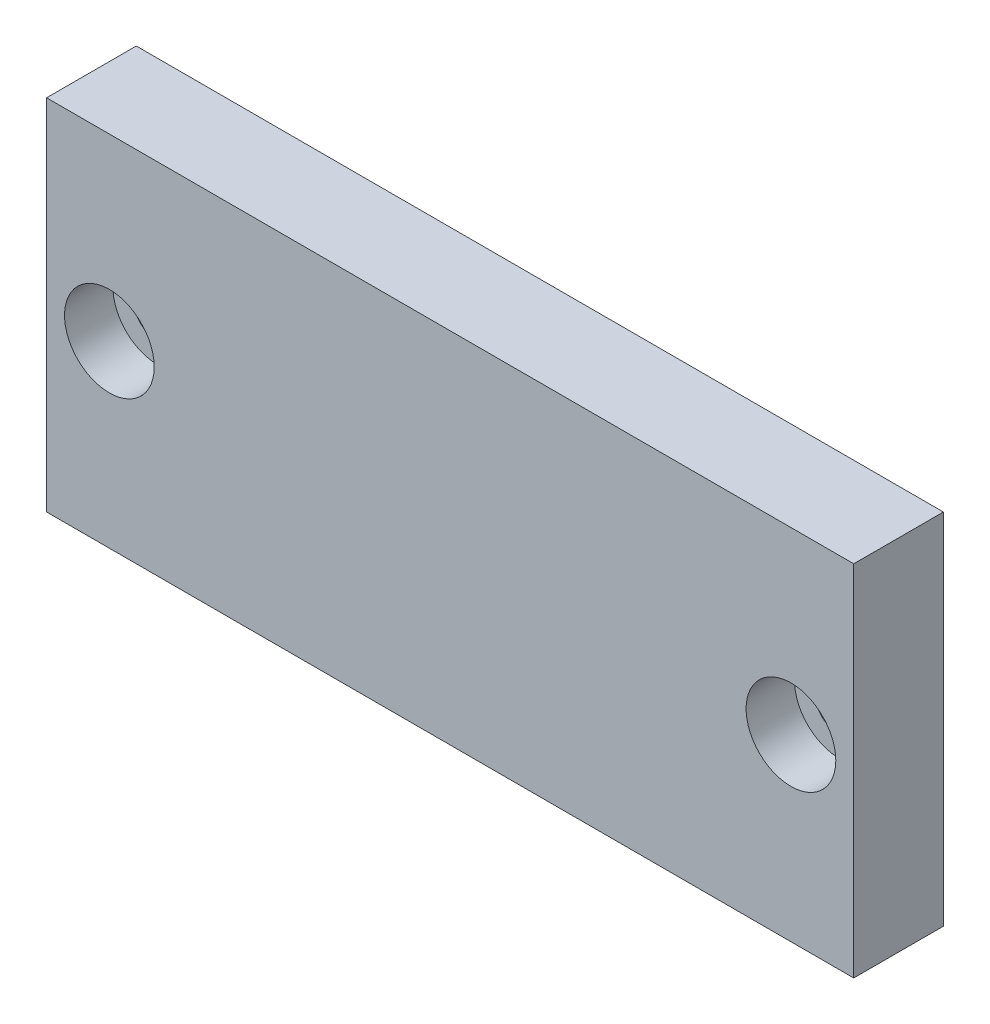
ISO-10303-21;
HEADER;
FILE_DESCRIPTION(('STEP AP214'),'2;1');
FILE_NAME('part.step','',(''),(''),'','','');
FILE_SCHEMA(('AUTOMOTIVE_DESIGN { 1 0 10303 214 1 1 1 1 }'));
ENDSEC;
DATA;
#1=APPLICATION_CONTEXT('core data for automotive mechanical design processes');
#2=APPLICATION_PROTOCOL_DEFINITION('international standard','automotive_design',2000,#1);
#3=PRODUCT_CONTEXT('',#1,'mechanical');
#4=PRODUCT('Part','Part','',(#3));
#5=PRODUCT_RELATED_PRODUCT_CATEGORY('part','',(#4));
#6=PRODUCT_DEFINITION_FORMATION('','',#4);
#7=PRODUCT_DEFINITION_CONTEXT('part definition',#1,'design');
#8=PRODUCT_DEFINITION('design','',#6,#7);
#9=PRODUCT_DEFINITION_SHAPE('','',#8);
#10=(LENGTH_UNIT() NAMED_UNIT(*) SI_UNIT(.MILLI.,.METRE.));
#11=(NAMED_UNIT(*) PLANE_ANGLE_UNIT() SI_UNIT($,.RADIAN.));
#12=(NAMED_UNIT(*) SI_UNIT($,.STERADIAN.) SOLID_ANGLE_UNIT());
#13=UNCERTAINTY_MEASURE_WITH_UNIT(LENGTH_MEASURE(1.E-05),#10,'distance_accuracy_value','');
#14=(GEOMETRIC_REPRESENTATION_CONTEXT(3) GLOBAL_UNCERTAINTY_ASSIGNED_CONTEXT((#13)) GLOBAL_UNIT_ASSIGNED_CONTEXT((#10,
#11,#12)) REPRESENTATION_CONTEXT('',''));
#15=CARTESIAN_POINT('',(0.,0.,0.));
#16=DIRECTION('',(0.,0.,1.));
#17=DIRECTION('',(1.,0.,0.));
#18=AXIS2_PLACEMENT_3D('',#15,#16,#17);
#19=CARTESIAN_POINT('',(36.1832797427653,-1.54340836012862,66.));
#20=DIRECTION('',(0.,0.,-1.));
#21=DIRECTION('',(-1.,0.,0.));
#22=AXIS2_PLACEMENT_3D('',#19,#20,#21);
#23=CYLINDRICAL_SURFACE('',#22,2.75);
#24=CARTESIAN_POINT('',(36.1832797427653,-1.54340836012862,0.));
#25=DIRECTION('',(0.,0.,1.));
#26=DIRECTION('',(1.,0.,0.));
#27=AXIS2_PLACEMENT_3D('',#24,#25,#26);
#28=CIRCLE('',#27,2.75);
#29=CARTESIAN_POINT('',(38.9332797427653,-1.54340836012862,0.));
#30=VERTEX_POINT('',#29);
#31=EDGE_CURVE('E117',#30,#30,#28,.F.);
#32=ORIENTED_EDGE('',*,*,#31,.T.);
#33=EDGE_LOOP('',(#32));
#34=FACE_BOUND('',#33,.T.);
#35=CARTESIAN_POINT('',(36.1832797427653,-1.54340836012862,4.6));
#36=DIRECTION('',(0.,0.,1.));
#37=DIRECTION('',(1.,0.,0.));
#38=AXIS2_PLACEMENT_3D('',#35,#36,#37);
#39=CIRCLE('',#38,2.75);
#40=CARTESIAN_POINT('',(38.9332797427653,-1.54340836012862,4.6));
#41=VERTEX_POINT('',#40);
#42=EDGE_CURVE('E43',#41,#41,#39,.T.);
#43=ORIENTED_EDGE('',*,*,#42,.T.);
#44=EDGE_LOOP('',(#43));
#45=FACE_BOUND('',#44,.T.);
#46=ADVANCED_FACE('F39',(#34,#45),#23,.F.);
#47=CARTESIAN_POINT('',(-39.8167202572347,-1.54340836012862,77.));
#48=DIRECTION('',(0.,0.,-1.));
#49=DIRECTION('',(-1.,0.,0.));
#50=AXIS2_PLACEMENT_3D('',#47,#48,#49);
#51=CYLINDRICAL_SURFACE('',#50,2.75);
#52=CARTESIAN_POINT('',(-39.8167202572347,-1.54340836012862,0.));
#53=DIRECTION('',(0.,0.,1.));
#54=DIRECTION('',(1.,0.,0.));
#55=AXIS2_PLACEMENT_3D('',#52,#53,#54);
#56=CIRCLE('',#55,2.75);
#57=CARTESIAN_POINT('',(-37.0667202572347,-1.54340836012862,0.));
#58=VERTEX_POINT('',#57);
#59=EDGE_CURVE('E109',#58,#58,#56,.F.);
#60=ORIENTED_EDGE('',*,*,#59,.T.);
#61=EDGE_LOOP('',(#60));
#62=FACE_BOUND('',#61,.T.);
#63=CARTESIAN_POINT('',(-39.8167202572347,-1.54340836012862,4.59999999999999));
#64=DIRECTION('',(0.,0.,1.));
#65=DIRECTION('',(1.,0.,0.));
#66=AXIS2_PLACEMENT_3D('',#63,#64,#65);
#67=CIRCLE('',#66,2.75);
#68=CARTESIAN_POINT('',(-37.0667202572347,-1.54340836012862,4.59999999999999));
#69=VERTEX_POINT('',#68);
#70=EDGE_CURVE('E119',#69,#69,#67,.T.);
#71=ORIENTED_EDGE('',*,*,#70,.T.);
#72=EDGE_LOOP('',(#71));
#73=FACE_BOUND('',#72,.T.);
#74=ADVANCED_FACE('F154',(#62,#73),#51,.F.);
#75=CARTESIAN_POINT('',(-46.8167202572347,18.4565916398714,10.));
#76=DIRECTION('',(1.,0.,0.));
#77=DIRECTION('',(0.,0.,-1.));
#78=AXIS2_PLACEMENT_3D('',#75,#76,#77);
#79=PLANE('',#78);
#80=DIRECTION('',(0.,-1.,0.));
#81=VECTOR('',#80,1.);
#82=CARTESIAN_POINT('',(-46.8167202572347,18.4565916398714,0.));
#83=LINE('',#82,#81);
#84=CARTESIAN_POINT('',(-46.8167202572347,18.4565916398714,0.));
#85=VERTEX_POINT('',#84);
#86=CARTESIAN_POINT('',(-46.8167202572347,-21.5434083601286,0.));
#87=VERTEX_POINT('',#86);
#88=EDGE_CURVE('E106',#85,#87,#83,.T.);
#89=ORIENTED_EDGE('',*,*,#88,.T.);
#90=DIRECTION('',(0.,0.,-1.));
#91=VECTOR('',#90,1.);
#92=CARTESIAN_POINT('',(-46.8167202572347,-21.5434083601286,10.));
#93=LINE('',#92,#91);
#94=CARTESIAN_POINT('',(-46.8167202572347,-21.5434083601286,10.));
#95=VERTEX_POINT('',#94);
#96=EDGE_CURVE('E11',#95,#87,#93,.T.);
#97=ORIENTED_EDGE('',*,*,#96,.F.);
#98=DIRECTION('',(0.,-1.,0.));
#99=VECTOR('',#98,1.);
#100=CARTESIAN_POINT('',(-46.8167202572347,18.4565916398714,10.));
#101=LINE('',#100,#99);
#102=CARTESIAN_POINT('',(-46.8167202572347,18.4565916398714,10.));
#103=VERTEX_POINT('',#102);
#104=EDGE_CURVE('E93',#103,#95,#101,.T.);
#105=ORIENTED_EDGE('',*,*,#104,.F.);
#106=DIRECTION('',(0.,0.,-1.));
#107=VECTOR('',#106,1.);
#108=CARTESIAN_POINT('',(-46.8167202572347,18.4565916398714,10.));
#109=LINE('',#108,#107);
#110=EDGE_CURVE('E102',#103,#85,#109,.T.);
#111=ORIENTED_EDGE('',*,*,#110,.T.);
#112=EDGE_LOOP('',(#89,#97,#105,#111));
#113=FACE_BOUND('',#112,.T.);
#114=ADVANCED_FACE('F41',(#113),#79,.F.);
#115=CARTESIAN_POINT('',(-46.8167202572347,-21.5434083601286,10.));
#116=DIRECTION('',(0.,1.,0.));
#117=DIRECTION('',(-1.,0.,0.));
#118=AXIS2_PLACEMENT_3D('',#115,#116,#117);
#119=PLANE('',#118);
#120=DIRECTION('',(1.,0.,0.));
#121=VECTOR('',#120,1.);
#122=CARTESIAN_POINT('',(-46.8167202572347,-21.5434083601286,0.));
#123=LINE('',#122,#121);
#124=CARTESIAN_POINT('',(43.1832797427653,-21.5434083601286,0.));
#125=VERTEX_POINT('',#124);
#126=EDGE_CURVE('E97',#87,#125,#123,.T.);
#127=ORIENTED_EDGE('',*,*,#126,.T.);
#128=DIRECTION('',(0.,0.,-1.));
#129=VECTOR('',#128,1.);
#130=CARTESIAN_POINT('',(43.1832797427653,-21.5434083601286,10.));
#131=LINE('',#130,#129);
#132=CARTESIAN_POINT('',(43.1832797427653,-21.5434083601286,10.));
#133=VERTEX_POINT('',#132);
#134=EDGE_CURVE('E49',#133,#125,#131,.T.);
#135=ORIENTED_EDGE('',*,*,#134,.F.);
#136=DIRECTION('',(1.,0.,0.));
#137=VECTOR('',#136,1.);
#138=CARTESIAN_POINT('',(-46.8167202572347,-21.5434083601286,10.));
#139=LINE('',#138,#137);
#140=EDGE_CURVE('E88',#95,#133,#139,.T.);
#141=ORIENTED_EDGE('',*,*,#140,.F.);
#142=ORIENTED_EDGE('',*,*,#96,.T.);
#143=EDGE_LOOP('',(#127,#135,#141,#142));
#144=FACE_BOUND('',#143,.T.);
#145=ADVANCED_FACE('F96',(#144),#119,.F.);
#146=CARTESIAN_POINT('',(43.1832797427653,18.4565916398714,10.));
#147=DIRECTION('',(-1.,0.,0.));
#148=DIRECTION('',(0.,0.,1.));
#149=AXIS2_PLACEMENT_3D('',#146,#147,#148);
#150=PLANE('',#149);
#151=DIRECTION('',(0.,1.,0.));
#152=VECTOR('',#151,1.);
#153=CARTESIAN_POINT('',(43.1832797427653,18.4565916398714,0.));
#154=LINE('',#153,#152);
#155=CARTESIAN_POINT('',(43.1832797427653,18.4565916398714,0.));
#156=VERTEX_POINT('',#155);
#157=EDGE_CURVE('E75',#125,#156,#154,.T.);
#158=ORIENTED_EDGE('',*,*,#157,.T.);
#159=DIRECTION('',(0.,0.,-1.));
#160=VECTOR('',#159,1.);
#161=CARTESIAN_POINT('',(43.1832797427653,18.4565916398714,10.));
#162=LINE('',#161,#160);
#163=CARTESIAN_POINT('',(43.1832797427653,18.4565916398714,10.));
#164=VERTEX_POINT('',#163);
#165=EDGE_CURVE('E98',#164,#156,#162,.T.);
#166=ORIENTED_EDGE('',*,*,#165,.F.);
#167=DIRECTION('',(0.,1.,0.));
#168=VECTOR('',#167,1.);
#169=CARTESIAN_POINT('',(43.1832797427653,18.4565916398714,10.));
#170=LINE('',#169,#168);
#171=EDGE_CURVE('E91',#133,#164,#170,.T.);
#172=ORIENTED_EDGE('',*,*,#171,.F.);
#173=ORIENTED_EDGE('',*,*,#134,.T.);
#174=EDGE_LOOP('',(#158,#166,#172,#173));
#175=FACE_BOUND('',#174,.T.);
#176=ADVANCED_FACE('F100',(#175),#150,.F.);
#177=CARTESIAN_POINT('',(-46.8167202572347,18.4565916398714,10.));
#178=DIRECTION('',(0.,-1.,0.));
#179=DIRECTION('',(0.,0.,-1.));
#180=AXIS2_PLACEMENT_3D('',#177,#178,#179);
#181=PLANE('',#180);
#182=DIRECTION('',(-1.,0.,0.));
#183=VECTOR('',#182,1.);
#184=CARTESIAN_POINT('',(-46.8167202572347,18.4565916398714,0.));
#185=LINE('',#184,#183);
#186=EDGE_CURVE('E81',#156,#85,#185,.T.);
#187=ORIENTED_EDGE('',*,*,#186,.T.);
#188=ORIENTED_EDGE('',*,*,#110,.F.);
#189=DIRECTION('',(-1.,0.,0.));
#190=VECTOR('',#189,1.);
#191=CARTESIAN_POINT('',(-46.8167202572347,18.4565916398714,10.));
#192=LINE('',#191,#190);
#193=EDGE_CURVE('E58',#164,#103,#192,.T.);
#194=ORIENTED_EDGE('',*,*,#193,.F.);
#195=ORIENTED_EDGE('',*,*,#165,.T.);
#196=EDGE_LOOP('',(#187,#188,#194,#195));
#197=FACE_BOUND('',#196,.T.);
#198=ADVANCED_FACE('F170',(#197),#181,.F.);
#199=CARTESIAN_POINT('',(0.,0.,10.));
#200=DIRECTION('',(0.,0.,1.));
#201=DIRECTION('',(1.,0.,0.));
#202=AXIS2_PLACEMENT_3D('',#199,#200,#201);
#203=PLANE('',#202);
#204=CARTESIAN_POINT('',(36.1832797427653,-1.54340836012862,10.));
#205=DIRECTION('',(0.,0.,1.));
#206=DIRECTION('',(1.,0.,0.));
#207=AXIS2_PLACEMENT_3D('',#204,#205,#206);
#208=CIRCLE('',#207,5.);
#209=CARTESIAN_POINT('',(41.1832797427653,-1.54340836012862,10.));
#210=VERTEX_POINT('',#209);
#211=EDGE_CURVE('E132',#210,#210,#208,.T.);
#212=ORIENTED_EDGE('',*,*,#211,.F.);
#213=EDGE_LOOP('',(#212));
#214=FACE_BOUND('',#213,.T.);
#215=CARTESIAN_POINT('',(-39.8167202572347,-1.54340836012862,10.));
#216=DIRECTION('',(0.,0.,1.));
#217=DIRECTION('',(1.,0.,0.));
#218=AXIS2_PLACEMENT_3D('',#215,#216,#217);
#219=CIRCLE('',#218,5.);
#220=CARTESIAN_POINT('',(-34.8167202572347,-1.54340836012862,10.));
#221=VERTEX_POINT('',#220);
#222=EDGE_CURVE('E125',#221,#221,#219,.T.);
#223=ORIENTED_EDGE('',*,*,#222,.F.);
#224=EDGE_LOOP('',(#223));
#225=FACE_BOUND('',#224,.T.);
#226=ORIENTED_EDGE('',*,*,#104,.T.);
#227=ORIENTED_EDGE('',*,*,#140,.T.);
#228=ORIENTED_EDGE('',*,*,#171,.T.);
#229=ORIENTED_EDGE('',*,*,#193,.T.);
#230=EDGE_LOOP('',(#226,#227,#228,#229));
#231=FACE_BOUND('',#230,.T.);
#232=ADVANCED_FACE('F89',(#214,#225,#231),#203,.T.);
#233=CARTESIAN_POINT('',(0.,0.,0.));
#234=DIRECTION('',(0.,0.,1.));
#235=DIRECTION('',(1.,0.,0.));
#236=AXIS2_PLACEMENT_3D('',#233,#234,#235);
#237=PLANE('',#236);
#238=ORIENTED_EDGE('',*,*,#31,.F.);
#239=EDGE_LOOP('',(#238));
#240=FACE_BOUND('',#239,.T.);
#241=ORIENTED_EDGE('',*,*,#59,.F.);
#242=EDGE_LOOP('',(#241));
#243=FACE_BOUND('',#242,.T.);
#244=ORIENTED_EDGE('',*,*,#88,.F.);
#245=ORIENTED_EDGE('',*,*,#186,.F.);
#246=ORIENTED_EDGE('',*,*,#157,.F.);
#247=ORIENTED_EDGE('',*,*,#126,.F.);
#248=EDGE_LOOP('',(#244,#245,#246,#247));
#249=FACE_BOUND('',#248,.T.);
#250=ADVANCED_FACE('F169',(#240,#243,#249),#237,.F.);
#251=CARTESIAN_POINT('',(-39.8167202572347,-1.54340836012862,4.6));
#252=DIRECTION('',(0.,0.,1.));
#253=DIRECTION('',(1.,0.,0.));
#254=AXIS2_PLACEMENT_3D('',#251,#252,#253);
#255=CYLINDRICAL_SURFACE('',#254,5.);
#256=CARTESIAN_POINT('',(-39.8167202572347,-1.54340836012862,4.6));
#257=DIRECTION('',(0.,0.,1.));
#258=DIRECTION('',(1.,0.,0.));
#259=AXIS2_PLACEMENT_3D('',#256,#257,#258);
#260=CIRCLE('',#259,5.);
#261=CARTESIAN_POINT('',(-34.8167202572347,-1.54340836012862,4.6));
#262=VERTEX_POINT('',#261);
#263=EDGE_CURVE('E121',#262,#262,#260,.T.);
#264=CARTESIAN_POINT('',(-34.8167202572347,-1.54340836012862,4.6));
#265=CARTESIAN_POINT('',(-34.8167202572347,-1.54340836012862,4.65625));
#266=CARTESIAN_POINT('',(-34.8167202572347,-1.54340836012862,4.7125));
#267=CARTESIAN_POINT('',(-34.8167202572347,-1.54340836012862,4.825));
#268=CARTESIAN_POINT('',(-34.8167202572347,-1.54340836012862,4.88125));
#269=CARTESIAN_POINT('',(-34.8167202572347,-1.54340836012862,4.99375));
#270=CARTESIAN_POINT('',(-34.8167202572347,-1.54340836012862,5.05));
#271=CARTESIAN_POINT('',(-34.8167202572347,-1.54340836012862,5.1625));
#272=CARTESIAN_POINT('',(-34.8167202572347,-1.54340836012862,5.21875));
#273=CARTESIAN_POINT('',(-34.8167202572347,-1.54340836012862,5.33125));
#274=CARTESIAN_POINT('',(-34.8167202572347,-1.54340836012862,5.3875));
#275=CARTESIAN_POINT('',(-34.8167202572347,-1.54340836012862,5.5));
#276=CARTESIAN_POINT('',(-34.8167202572347,-1.54340836012862,5.55625));
#277=CARTESIAN_POINT('',(-34.8167202572347,-1.54340836012862,5.66875));
#278=CARTESIAN_POINT('',(-34.8167202572347,-1.54340836012862,5.725));
#279=CARTESIAN_POINT('',(-34.8167202572347,-1.54340836012862,5.8375));
#280=CARTESIAN_POINT('',(-34.8167202572347,-1.54340836012862,5.89375));
#281=CARTESIAN_POINT('',(-34.8167202572347,-1.54340836012862,6.00625));
#282=CARTESIAN_POINT('',(-34.8167202572347,-1.54340836012862,6.0625));
#283=CARTESIAN_POINT('',(-34.8167202572347,-1.54340836012862,6.175));
#284=CARTESIAN_POINT('',(-34.8167202572347,-1.54340836012862,6.23125));
#285=CARTESIAN_POINT('',(-34.8167202572347,-1.54340836012862,6.34375));
#286=CARTESIAN_POINT('',(-34.8167202572347,-1.54340836012862,6.4));
#287=CARTESIAN_POINT('',(-34.8167202572347,-1.54340836012862,6.5125));
#288=CARTESIAN_POINT('',(-34.8167202572347,-1.54340836012862,6.56875));
#289=CARTESIAN_POINT('',(-34.8167202572347,-1.54340836012862,6.68125));
#290=CARTESIAN_POINT('',(-34.8167202572347,-1.54340836012862,6.7375));
#291=CARTESIAN_POINT('',(-34.8167202572347,-1.54340836012862,6.85));
#292=CARTESIAN_POINT('',(-34.8167202572347,-1.54340836012862,6.90625));
#293=CARTESIAN_POINT('',(-34.8167202572347,-1.54340836012862,7.01875));
#294=CARTESIAN_POINT('',(-34.8167202572347,-1.54340836012862,7.075));
#295=CARTESIAN_POINT('',(-34.8167202572347,-1.54340836012862,7.1875));
#296=CARTESIAN_POINT('',(-34.8167202572347,-1.54340836012862,7.24375));
#297=CARTESIAN_POINT('',(-34.8167202572347,-1.54340836012862,7.35625));
#298=CARTESIAN_POINT('',(-34.8167202572347,-1.54340836012862,7.4125));
#299=CARTESIAN_POINT('',(-34.8167202572347,-1.54340836012862,7.525));
#300=CARTESIAN_POINT('',(-34.8167202572347,-1.54340836012862,7.58125));
#301=CARTESIAN_POINT('',(-34.8167202572347,-1.54340836012862,7.69375));
#302=CARTESIAN_POINT('',(-34.8167202572347,-1.54340836012862,7.75));
#303=CARTESIAN_POINT('',(-34.8167202572347,-1.54340836012862,7.8625));
#304=CARTESIAN_POINT('',(-34.8167202572347,-1.54340836012862,7.91875));
#305=CARTESIAN_POINT('',(-34.8167202572347,-1.54340836012862,8.03125));
#306=CARTESIAN_POINT('',(-34.8167202572347,-1.54340836012862,8.0875));
#307=CARTESIAN_POINT('',(-34.8167202572347,-1.54340836012862,8.2));
#308=CARTESIAN_POINT('',(-34.8167202572347,-1.54340836012862,8.25625));
#309=CARTESIAN_POINT('',(-34.8167202572347,-1.54340836012862,8.36875));
#310=CARTESIAN_POINT('',(-34.8167202572347,-1.54340836012862,8.425));
#311=CARTESIAN_POINT('',(-34.8167202572347,-1.54340836012862,8.5375));
#312=CARTESIAN_POINT('',(-34.8167202572347,-1.54340836012862,8.59375));
#313=CARTESIAN_POINT('',(-34.8167202572347,-1.54340836012862,8.70625));
#314=CARTESIAN_POINT('',(-34.8167202572347,-1.54340836012862,8.7625));
#315=CARTESIAN_POINT('',(-34.8167202572347,-1.54340836012862,8.875));
#316=CARTESIAN_POINT('',(-34.8167202572347,-1.54340836012862,8.93125));
#317=CARTESIAN_POINT('',(-34.8167202572347,-1.54340836012862,9.04375));
#318=CARTESIAN_POINT('',(-34.8167202572347,-1.54340836012862,9.1));
#319=CARTESIAN_POINT('',(-34.8167202572347,-1.54340836012862,9.2125));
#320=CARTESIAN_POINT('',(-34.8167202572347,-1.54340836012862,9.26875));
#321=CARTESIAN_POINT('',(-34.8167202572347,-1.54340836012862,9.38125));
#322=CARTESIAN_POINT('',(-34.8167202572347,-1.54340836012862,9.4375));
#323=CARTESIAN_POINT('',(-34.8167202572347,-1.54340836012862,9.55));
#324=CARTESIAN_POINT('',(-34.8167202572347,-1.54340836012862,9.60625));
#325=CARTESIAN_POINT('',(-34.8167202572347,-1.54340836012862,9.71875));
#326=CARTESIAN_POINT('',(-34.8167202572347,-1.54340836012862,9.775));
#327=CARTESIAN_POINT('',(-34.8167202572347,-1.54340836012862,9.8875));
#328=CARTESIAN_POINT('',(-34.8167202572347,-1.54340836012862,9.94375));
#329=CARTESIAN_POINT('',(-34.8167202572347,-1.54340836012862,10.));
#330=B_SPLINE_CURVE_WITH_KNOTS('',3,(#264,#265,#266,#267,#268,#269,#270,#271,#272,#273,#274,
#275,#276,#277,#278,#279,#280,#281,#282,#283,#284,#285,#286,#287,#288,#289,#290,#291,#292,#293,
#294,#295,#296,#297,#298,#299,#300,#301,#302,#303,#304,#305,#306,#307,#308,#309,#310,#311,#312,
#313,#314,#315,#316,#317,#318,#319,#320,#321,#322,#323,#324,#325,#326,#327,#328,#329),
.UNSPECIFIED.,.F.,.F.,(4,2,2,2,2,2,2,2,2,2,2,2,2,2,2,2,2,2,2,2,2,2,2,2,2,2,2,2,2,2,2,2,4),(0.,
0.16875,0.337499999999999,0.50625,0.674999999999999,0.84375,1.0125,1.18125,1.35,1.51875,1.6875,
1.85625,2.025,2.19375,2.3625,2.53125,2.7,2.86875,3.0375,3.20625,3.375,3.54375,3.7125,3.88125,
4.05,4.21875,4.3875,4.55625,4.725,4.89375,5.0625,5.23125,5.4),.UNSPECIFIED.);
#331=EDGE_CURVE('BSEAM165',#262,#221,#330,.T.);
#332=ORIENTED_EDGE('',*,*,#263,.F.);
#333=ORIENTED_EDGE('',*,*,#222,.T.);
#334=ORIENTED_EDGE('',*,*,#331,.T.);
#335=ORIENTED_EDGE('',*,*,#331,.F.);
#336=EDGE_LOOP('',(#332,#334,#333,#335));
#337=FACE_BOUND('',#336,.T.);
#338=ADVANCED_FACE('F165',(#337),#255,.F.);
#339=CARTESIAN_POINT('',(-39.8167202572347,-1.54340836012862,4.6));
#340=DIRECTION('',(0.,0.,1.));
#341=DIRECTION('',(1.,0.,0.));
#342=AXIS2_PLACEMENT_3D('',#339,#340,#341);
#343=PLANE('',#342);
#344=ORIENTED_EDGE('',*,*,#70,.F.);
#345=EDGE_LOOP('',(#344));
#346=FACE_BOUND('',#345,.T.);
#347=ORIENTED_EDGE('',*,*,#263,.T.);
#348=EDGE_LOOP('',(#347));
#349=FACE_BOUND('',#348,.T.);
#350=ADVANCED_FACE('F150',(#346,#349),#343,.T.);
#351=CARTESIAN_POINT('',(36.1832797427653,-1.54340836012862,4.6));
#352=DIRECTION('',(0.,0.,1.));
#353=DIRECTION('',(1.,0.,0.));
#354=AXIS2_PLACEMENT_3D('',#351,#352,#353);
#355=CYLINDRICAL_SURFACE('',#354,5.);
#356=CARTESIAN_POINT('',(36.1832797427653,-1.54340836012862,4.6));
#357=DIRECTION('',(0.,0.,1.));
#358=DIRECTION('',(1.,0.,0.));
#359=AXIS2_PLACEMENT_3D('',#356,#357,#358);
#360=CIRCLE('',#359,5.);
#361=CARTESIAN_POINT('',(41.1832797427653,-1.54340836012862,4.6));
#362=VERTEX_POINT('',#361);
#363=EDGE_CURVE('E135',#362,#362,#360,.T.);
#364=CARTESIAN_POINT('',(41.1832797427653,-1.54340836012862,4.6));
#365=CARTESIAN_POINT('',(41.1832797427653,-1.54340836012862,4.65625));
#366=CARTESIAN_POINT('',(41.1832797427653,-1.54340836012862,4.7125));
#367=CARTESIAN_POINT('',(41.1832797427653,-1.54340836012862,4.825));
#368=CARTESIAN_POINT('',(41.1832797427653,-1.54340836012862,4.88125));
#369=CARTESIAN_POINT('',(41.1832797427653,-1.54340836012862,4.99375));
#370=CARTESIAN_POINT('',(41.1832797427653,-1.54340836012862,5.05));
#371=CARTESIAN_POINT('',(41.1832797427653,-1.54340836012862,5.1625));
#372=CARTESIAN_POINT('',(41.1832797427653,-1.54340836012862,5.21875));
#373=CARTESIAN_POINT('',(41.1832797427653,-1.54340836012862,5.33125));
#374=CARTESIAN_POINT('',(41.1832797427653,-1.54340836012862,5.3875));
#375=CARTESIAN_POINT('',(41.1832797427653,-1.54340836012862,5.5));
#376=CARTESIAN_POINT('',(41.1832797427653,-1.54340836012862,5.55625));
#377=CARTESIAN_POINT('',(41.1832797427653,-1.54340836012862,5.66875));
#378=CARTESIAN_POINT('',(41.1832797427653,-1.54340836012862,5.725));
#379=CARTESIAN_POINT('',(41.1832797427653,-1.54340836012862,5.8375));
#380=CARTESIAN_POINT('',(41.1832797427653,-1.54340836012862,5.89375));
#381=CARTESIAN_POINT('',(41.1832797427653,-1.54340836012862,6.00625));
#382=CARTESIAN_POINT('',(41.1832797427653,-1.54340836012862,6.0625));
#383=CARTESIAN_POINT('',(41.1832797427653,-1.54340836012862,6.175));
#384=CARTESIAN_POINT('',(41.1832797427653,-1.54340836012862,6.23125));
#385=CARTESIAN_POINT('',(41.1832797427653,-1.54340836012862,6.34375));
#386=CARTESIAN_POINT('',(41.1832797427653,-1.54340836012862,6.4));
#387=CARTESIAN_POINT('',(41.1832797427653,-1.54340836012862,6.5125));
#388=CARTESIAN_POINT('',(41.1832797427653,-1.54340836012862,6.56875));
#389=CARTESIAN_POINT('',(41.1832797427653,-1.54340836012862,6.68125));
#390=CARTESIAN_POINT('',(41.1832797427653,-1.54340836012862,6.7375));
#391=CARTESIAN_POINT('',(41.1832797427653,-1.54340836012862,6.85));
#392=CARTESIAN_POINT('',(41.1832797427653,-1.54340836012862,6.90625));
#393=CARTESIAN_POINT('',(41.1832797427653,-1.54340836012862,7.01875));
#394=CARTESIAN_POINT('',(41.1832797427653,-1.54340836012862,7.075));
#395=CARTESIAN_POINT('',(41.1832797427653,-1.54340836012862,7.1875));
#396=CARTESIAN_POINT('',(41.1832797427653,-1.54340836012862,7.24375));
#397=CARTESIAN_POINT('',(41.1832797427653,-1.54340836012862,7.35625));
#398=CARTESIAN_POINT('',(41.1832797427653,-1.54340836012862,7.4125));
#399=CARTESIAN_POINT('',(41.1832797427653,-1.54340836012862,7.525));
#400=CARTESIAN_POINT('',(41.1832797427653,-1.54340836012862,7.58125));
#401=CARTESIAN_POINT('',(41.1832797427653,-1.54340836012862,7.69375));
#402=CARTESIAN_POINT('',(41.1832797427653,-1.54340836012862,7.75));
#403=CARTESIAN_POINT('',(41.1832797427653,-1.54340836012862,7.8625));
#404=CARTESIAN_POINT('',(41.1832797427653,-1.54340836012862,7.91875));
#405=CARTESIAN_POINT('',(41.1832797427653,-1.54340836012862,8.03125));
#406=CARTESIAN_POINT('',(41.1832797427653,-1.54340836012862,8.0875));
#407=CARTESIAN_POINT('',(41.1832797427653,-1.54340836012862,8.2));
#408=CARTESIAN_POINT('',(41.1832797427653,-1.54340836012862,8.25625));
#409=CARTESIAN_POINT('',(41.1832797427653,-1.54340836012862,8.36875));
#410=CARTESIAN_POINT('',(41.1832797427653,-1.54340836012862,8.425));
#411=CARTESIAN_POINT('',(41.1832797427653,-1.54340836012862,8.5375));
#412=CARTESIAN_POINT('',(41.1832797427653,-1.54340836012862,8.59375));
#413=CARTESIAN_POINT('',(41.1832797427653,-1.54340836012862,8.70625));
#414=CARTESIAN_POINT('',(41.1832797427653,-1.54340836012862,8.7625));
#415=CARTESIAN_POINT('',(41.1832797427653,-1.54340836012862,8.875));
#416=CARTESIAN_POINT('',(41.1832797427653,-1.54340836012862,8.93125));
#417=CARTESIAN_POINT('',(41.1832797427653,-1.54340836012862,9.04375));
#418=CARTESIAN_POINT('',(41.1832797427653,-1.54340836012862,9.1));
#419=CARTESIAN_POINT('',(41.1832797427653,-1.54340836012862,9.2125));
#420=CARTESIAN_POINT('',(41.1832797427653,-1.54340836012862,9.26875));
#421=CARTESIAN_POINT('',(41.1832797427653,-1.54340836012862,9.38125));
#422=CARTESIAN_POINT('',(41.1832797427653,-1.54340836012862,9.4375));
#423=CARTESIAN_POINT('',(41.1832797427653,-1.54340836012862,9.55));
#424=CARTESIAN_POINT('',(41.1832797427653,-1.54340836012862,9.60625));
#425=CARTESIAN_POINT('',(41.1832797427653,-1.54340836012862,9.71875));
#426=CARTESIAN_POINT('',(41.1832797427653,-1.54340836012862,9.775));
#427=CARTESIAN_POINT('',(41.1832797427653,-1.54340836012862,9.8875));
#428=CARTESIAN_POINT('',(41.1832797427653,-1.54340836012862,9.94375));
#429=CARTESIAN_POINT('',(41.1832797427653,-1.54340836012862,10.));
#430=B_SPLINE_CURVE_WITH_KNOTS('',3,(#364,#365,#366,#367,#368,#369,#370,#371,#372,#373,#374,
#375,#376,#377,#378,#379,#380,#381,#382,#383,#384,#385,#386,#387,#388,#389,#390,#391,#392,#393,
#394,#395,#396,#397,#398,#399,#400,#401,#402,#403,#404,#405,#406,#407,#408,#409,#410,#411,#412,
#413,#414,#415,#416,#417,#418,#419,#420,#421,#422,#423,#424,#425,#426,#427,#428,#429),
.UNSPECIFIED.,.F.,.F.,(4,2,2,2,2,2,2,2,2,2,2,2,2,2,2,2,2,2,2,2,2,2,2,2,2,2,2,2,2,2,2,2,4),(0.,
0.16875,0.337499999999999,0.50625,0.674999999999999,0.84375,1.0125,1.18125,1.35,1.51875,1.6875,
1.85625,2.025,2.19375,2.3625,2.53125,2.7,2.86875,3.0375,3.20625,3.375,3.54375,3.7125,3.88125,
4.05,4.21875,4.3875,4.55625,4.725,4.89375,5.0625,5.23125,5.4),.UNSPECIFIED.);
#431=EDGE_CURVE('BSEAM145',#362,#210,#430,.T.);
#432=ORIENTED_EDGE('',*,*,#363,.F.);
#433=ORIENTED_EDGE('',*,*,#211,.T.);
#434=ORIENTED_EDGE('',*,*,#431,.T.);
#435=ORIENTED_EDGE('',*,*,#431,.F.);
#436=EDGE_LOOP('',(#432,#434,#433,#435));
#437=FACE_BOUND('',#436,.T.);
#438=ADVANCED_FACE('F145',(#437),#355,.F.);
#439=CARTESIAN_POINT('',(36.1832797427653,-1.54340836012862,4.6));
#440=DIRECTION('',(0.,0.,1.));
#441=DIRECTION('',(1.,0.,0.));
#442=AXIS2_PLACEMENT_3D('',#439,#440,#441);
#443=PLANE('',#442);
#444=ORIENTED_EDGE('',*,*,#42,.F.);
#445=EDGE_LOOP('',(#444));
#446=FACE_BOUND('',#445,.T.);
#447=ORIENTED_EDGE('',*,*,#363,.T.);
#448=EDGE_LOOP('',(#447));
#449=FACE_BOUND('',#448,.T.);
#450=ADVANCED_FACE('F143',(#446,#449),#443,.T.);
#451=CLOSED_SHELL('',(#46,#74,#114,#145,#176,#198,#232,#250,#338,#350,#438,#450));
#452=MANIFOLD_SOLID_BREP('B2',#451);
#453=ADVANCED_BREP_SHAPE_REPRESENTATION('',(#18,#452),#14);
#454=SHAPE_DEFINITION_REPRESENTATION(#9,#453);
ENDSEC;
END-ISO-10303-21;
